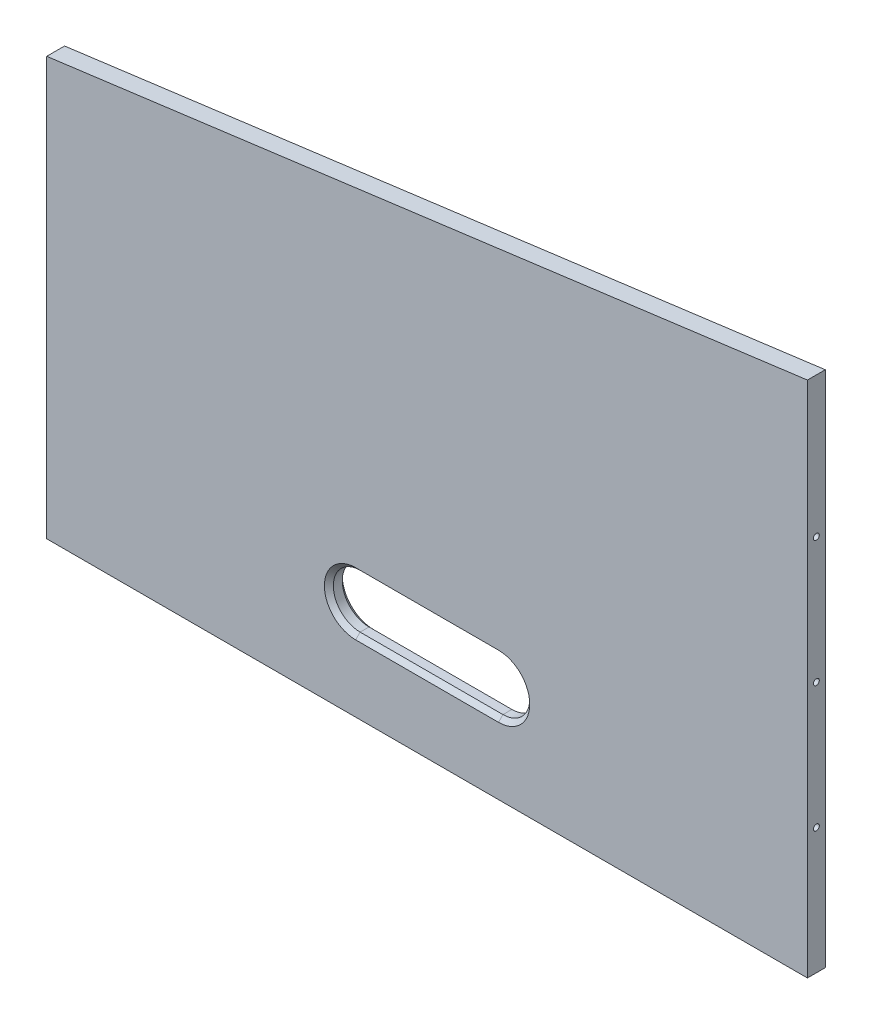
ISO-10303-21;
HEADER;
FILE_DESCRIPTION(('STEP AP214'),'2;1');
FILE_NAME('part.step','',(''),(''),'','','');
FILE_SCHEMA(('AUTOMOTIVE_DESIGN { 1 0 10303 214 1 1 1 1 }'));
ENDSEC;
DATA;
#1=APPLICATION_CONTEXT('core data for automotive mechanical design processes');
#2=APPLICATION_PROTOCOL_DEFINITION('international standard','automotive_design',2000,#1);
#3=PRODUCT_CONTEXT('',#1,'mechanical');
#4=PRODUCT('Part','Part','',(#3));
#5=PRODUCT_RELATED_PRODUCT_CATEGORY('part','',(#4));
#6=PRODUCT_DEFINITION_FORMATION('','',#4);
#7=PRODUCT_DEFINITION_CONTEXT('part definition',#1,'design');
#8=PRODUCT_DEFINITION('design','',#6,#7);
#9=PRODUCT_DEFINITION_SHAPE('','',#8);
#10=(LENGTH_UNIT() NAMED_UNIT(*) SI_UNIT(.MILLI.,.METRE.));
#11=(NAMED_UNIT(*) PLANE_ANGLE_UNIT() SI_UNIT($,.RADIAN.));
#12=(NAMED_UNIT(*) SI_UNIT($,.STERADIAN.) SOLID_ANGLE_UNIT());
#13=UNCERTAINTY_MEASURE_WITH_UNIT(LENGTH_MEASURE(1.E-05),#10,'distance_accuracy_value','');
#14=(GEOMETRIC_REPRESENTATION_CONTEXT(3) GLOBAL_UNCERTAINTY_ASSIGNED_CONTEXT((#13)) GLOBAL_UNIT_ASSIGNED_CONTEXT((#10,
#11,#12)) REPRESENTATION_CONTEXT('',''));
#15=CARTESIAN_POINT('',(0.,0.,0.));
#16=DIRECTION('',(0.,0.,1.));
#17=DIRECTION('',(1.,0.,0.));
#18=AXIS2_PLACEMENT_3D('',#15,#16,#17);
#19=CARTESIAN_POINT('',(0.,234.,10.));
#20=DIRECTION('',(-1.,0.,0.));
#21=DIRECTION('',(0.,0.,1.));
#22=AXIS2_PLACEMENT_3D('',#19,#20,#21);
#23=PLANE('',#22);
#24=CARTESIAN_POINT('',(0.,70.5,5.));
#25=DIRECTION('',(1.,0.,0.));
#26=DIRECTION('',(0.,0.,-1.));
#27=AXIS2_PLACEMENT_3D('',#24,#25,#26);
#28=CIRCLE('',#27,1.64999999999998);
#29=CARTESIAN_POINT('',(0.,70.5,3.35000000000002));
#30=VERTEX_POINT('',#29);
#31=EDGE_CURVE('E177',#30,#30,#28,.T.);
#32=ORIENTED_EDGE('',*,*,#31,.F.);
#33=EDGE_LOOP('',(#32));
#34=FACE_BOUND('',#33,.T.);
#35=CARTESIAN_POINT('',(0.,141.,5.));
#36=DIRECTION('',(1.,0.,0.));
#37=DIRECTION('',(0.,0.,-1.));
#38=AXIS2_PLACEMENT_3D('',#35,#36,#37);
#39=CIRCLE('',#38,1.64999999999998);
#40=CARTESIAN_POINT('',(0.,141.,3.35000000000002));
#41=VERTEX_POINT('',#40);
#42=EDGE_CURVE('E176',#41,#41,#39,.T.);
#43=ORIENTED_EDGE('',*,*,#42,.F.);
#44=EDGE_LOOP('',(#43));
#45=FACE_BOUND('',#44,.T.);
#46=CARTESIAN_POINT('',(0.,211.5,5.));
#47=DIRECTION('',(1.,0.,0.));
#48=DIRECTION('',(0.,0.,-1.));
#49=AXIS2_PLACEMENT_3D('',#46,#47,#48);
#50=CIRCLE('',#49,1.64999999999998);
#51=CARTESIAN_POINT('',(0.,211.5,3.35000000000002));
#52=VERTEX_POINT('',#51);
#53=EDGE_CURVE('E187',#52,#52,#50,.T.);
#54=ORIENTED_EDGE('',*,*,#53,.F.);
#55=EDGE_LOOP('',(#54));
#56=FACE_BOUND('',#55,.T.);
#57=DIRECTION('',(0.,1.,0.));
#58=VECTOR('',#57,1.);
#59=CARTESIAN_POINT('',(0.,234.,0.));
#60=LINE('',#59,#58);
#61=CARTESIAN_POINT('',(0.,0.,0.));
#62=VERTEX_POINT('',#61);
#63=CARTESIAN_POINT('',(0.,290.,0.));
#64=VERTEX_POINT('',#63);
#65=EDGE_CURVE('E233',#62,#64,#60,.T.);
#66=ORIENTED_EDGE('',*,*,#65,.T.);
#67=DIRECTION('',(0.,0.,-1.));
#68=VECTOR('',#67,1.);
#69=CARTESIAN_POINT('',(0.,290.,10.));
#70=LINE('',#69,#68);
#71=CARTESIAN_POINT('',(0.,290.,10.));
#72=VERTEX_POINT('',#71);
#73=EDGE_CURVE('E269',#72,#64,#70,.T.);
#74=ORIENTED_EDGE('',*,*,#73,.F.);
#75=DIRECTION('',(0.,1.,0.));
#76=VECTOR('',#75,1.);
#77=CARTESIAN_POINT('',(0.,0.,10.));
#78=LINE('',#77,#76);
#79=CARTESIAN_POINT('',(0.,0.,10.));
#80=VERTEX_POINT('',#79);
#81=EDGE_CURVE('E244',#80,#72,#78,.T.);
#82=ORIENTED_EDGE('',*,*,#81,.F.);
#83=DIRECTION('',(0.,0.,-1.));
#84=VECTOR('',#83,1.);
#85=CARTESIAN_POINT('',(0.,0.,10.));
#86=LINE('',#85,#84);
#87=EDGE_CURVE('E253',#80,#62,#86,.T.);
#88=ORIENTED_EDGE('',*,*,#87,.T.);
#89=EDGE_LOOP('',(#66,#74,#82,#88));
#90=FACE_BOUND('',#89,.T.);
#91=ADVANCED_FACE('F50',(#34,#45,#56,#90),#23,.F.);
#92=CARTESIAN_POINT('',(0.,290.,10.));
#93=DIRECTION('',(0.130334101809919,-0.991470131625457,0.));
#94=DIRECTION('',(0.991470131625457,0.130334101809919,0.));
#95=AXIS2_PLACEMENT_3D('',#92,#93,#94);
#96=PLANE('',#95);
#97=DIRECTION('',(-0.991470131625457,-0.130334101809919,0.));
#98=VECTOR('',#97,1.);
#99=CARTESIAN_POINT('',(0.,290.,0.));
#100=LINE('',#99,#98);
#101=CARTESIAN_POINT('',(-426.,234.,0.));
#102=VERTEX_POINT('',#101);
#103=EDGE_CURVE('E255',#64,#102,#100,.T.);
#104=ORIENTED_EDGE('',*,*,#103,.T.);
#105=DIRECTION('',(0.,0.,-1.));
#106=VECTOR('',#105,1.);
#107=CARTESIAN_POINT('',(-426.,234.,10.));
#108=LINE('',#107,#106);
#109=CARTESIAN_POINT('',(-426.,234.,10.));
#110=VERTEX_POINT('',#109);
#111=EDGE_CURVE('E266',#110,#102,#108,.T.);
#112=ORIENTED_EDGE('',*,*,#111,.F.);
#113=DIRECTION('',(-0.991470131625457,-0.130334101809919,0.));
#114=VECTOR('',#113,1.);
#115=CARTESIAN_POINT('',(0.,290.,10.));
#116=LINE('',#115,#114);
#117=EDGE_CURVE('E246',#72,#110,#116,.T.);
#118=ORIENTED_EDGE('',*,*,#117,.F.);
#119=ORIENTED_EDGE('',*,*,#73,.T.);
#120=EDGE_LOOP('',(#104,#112,#118,#119));
#121=FACE_BOUND('',#120,.T.);
#122=ADVANCED_FACE('F379',(#121),#96,.F.);
#123=CARTESIAN_POINT('',(-426.,0.,10.));
#124=DIRECTION('',(1.,0.,0.));
#125=DIRECTION('',(0.,0.,-1.));
#126=AXIS2_PLACEMENT_3D('',#123,#124,#125);
#127=PLANE('',#126);
#128=CARTESIAN_POINT('',(-426.,70.4999999999999,5.));
#129=DIRECTION('',(-1.,0.,0.));
#130=DIRECTION('',(0.,0.,1.));
#131=AXIS2_PLACEMENT_3D('',#128,#129,#130);
#132=CIRCLE('',#131,1.64999999999998);
#133=CARTESIAN_POINT('',(-426.,70.4999999999999,6.64999999999999));
#134=VERTEX_POINT('',#133);
#135=EDGE_CURVE('E193',#134,#134,#132,.T.);
#136=ORIENTED_EDGE('',*,*,#135,.F.);
#137=EDGE_LOOP('',(#136));
#138=FACE_BOUND('',#137,.T.);
#139=CARTESIAN_POINT('',(-426.,141.,5.));
#140=DIRECTION('',(-1.,0.,0.));
#141=DIRECTION('',(0.,0.,1.));
#142=AXIS2_PLACEMENT_3D('',#139,#140,#141);
#143=CIRCLE('',#142,1.64999999999998);
#144=CARTESIAN_POINT('',(-426.,141.,6.64999999999999));
#145=VERTEX_POINT('',#144);
#146=EDGE_CURVE('E199',#145,#145,#143,.T.);
#147=ORIENTED_EDGE('',*,*,#146,.F.);
#148=EDGE_LOOP('',(#147));
#149=FACE_BOUND('',#148,.T.);
#150=CARTESIAN_POINT('',(-426.,211.5,5.));
#151=DIRECTION('',(-1.,0.,0.));
#152=DIRECTION('',(0.,0.,1.));
#153=AXIS2_PLACEMENT_3D('',#150,#151,#152);
#154=CIRCLE('',#153,1.64999999999998);
#155=CARTESIAN_POINT('',(-426.,211.5,6.64999999999999));
#156=VERTEX_POINT('',#155);
#157=EDGE_CURVE('E205',#156,#156,#154,.T.);
#158=ORIENTED_EDGE('',*,*,#157,.F.);
#159=EDGE_LOOP('',(#158));
#160=FACE_BOUND('',#159,.T.);
#161=DIRECTION('',(0.,-1.,0.));
#162=VECTOR('',#161,1.);
#163=CARTESIAN_POINT('',(-426.,0.,0.));
#164=LINE('',#163,#162);
#165=CARTESIAN_POINT('',(-426.,0.,0.));
#166=VERTEX_POINT('',#165);
#167=EDGE_CURVE('E257',#102,#166,#164,.T.);
#168=ORIENTED_EDGE('',*,*,#167,.T.);
#169=DIRECTION('',(0.,0.,-1.));
#170=VECTOR('',#169,1.);
#171=CARTESIAN_POINT('',(-426.,0.,10.));
#172=LINE('',#171,#170);
#173=CARTESIAN_POINT('',(-426.,0.,10.));
#174=VERTEX_POINT('',#173);
#175=EDGE_CURVE('E263',#174,#166,#172,.T.);
#176=ORIENTED_EDGE('',*,*,#175,.F.);
#177=DIRECTION('',(0.,-1.,0.));
#178=VECTOR('',#177,1.);
#179=CARTESIAN_POINT('',(-426.,0.,10.));
#180=LINE('',#179,#178);
#181=EDGE_CURVE('E249',#110,#174,#180,.T.);
#182=ORIENTED_EDGE('',*,*,#181,.F.);
#183=ORIENTED_EDGE('',*,*,#111,.T.);
#184=EDGE_LOOP('',(#168,#176,#182,#183));
#185=FACE_BOUND('',#184,.T.);
#186=ADVANCED_FACE('F384',(#138,#149,#160,#185),#127,.F.);
#187=CARTESIAN_POINT('',(0.,0.,10.));
#188=DIRECTION('',(0.,1.,0.));
#189=DIRECTION('',(-1.,0.,0.));
#190=AXIS2_PLACEMENT_3D('',#187,#188,#189);
#191=PLANE('',#190);
#192=CARTESIAN_POINT('',(-63.,0.,5.));
#193=DIRECTION('',(0.,-1.,0.));
#194=DIRECTION('',(0.,0.,-1.));
#195=AXIS2_PLACEMENT_3D('',#192,#193,#194);
#196=CIRCLE('',#195,1.65);
#197=CARTESIAN_POINT('',(-63.,0.,3.35));
#198=VERTEX_POINT('',#197);
#199=EDGE_CURVE('E211',#198,#198,#196,.T.);
#200=ORIENTED_EDGE('',*,*,#199,.F.);
#201=EDGE_LOOP('',(#200));
#202=FACE_BOUND('',#201,.T.);
#203=CARTESIAN_POINT('',(-213.,0.,5.00000000000002));
#204=DIRECTION('',(0.,-1.,0.));
#205=DIRECTION('',(0.,0.,-1.));
#206=AXIS2_PLACEMENT_3D('',#203,#204,#205);
#207=CIRCLE('',#206,1.65000000000001);
#208=CARTESIAN_POINT('',(-213.,0.,3.35000000000001));
#209=VERTEX_POINT('',#208);
#210=EDGE_CURVE('E217',#209,#209,#207,.T.);
#211=ORIENTED_EDGE('',*,*,#210,.F.);
#212=EDGE_LOOP('',(#211));
#213=FACE_BOUND('',#212,.T.);
#214=CARTESIAN_POINT('',(-363.,0.,5.00000000000003));
#215=DIRECTION('',(0.,-1.,0.));
#216=DIRECTION('',(0.,0.,-1.));
#217=AXIS2_PLACEMENT_3D('',#214,#215,#216);
#218=CIRCLE('',#217,1.64999999999998);
#219=CARTESIAN_POINT('',(-363.,0.,3.35000000000005));
#220=VERTEX_POINT('',#219);
#221=EDGE_CURVE('E223',#220,#220,#218,.T.);
#222=ORIENTED_EDGE('',*,*,#221,.F.);
#223=EDGE_LOOP('',(#222));
#224=FACE_BOUND('',#223,.T.);
#225=DIRECTION('',(1.,0.,0.));
#226=VECTOR('',#225,1.);
#227=CARTESIAN_POINT('',(0.,0.,0.));
#228=LINE('',#227,#226);
#229=EDGE_CURVE('E247',#166,#62,#228,.T.);
#230=ORIENTED_EDGE('',*,*,#229,.T.);
#231=ORIENTED_EDGE('',*,*,#87,.F.);
#232=DIRECTION('',(1.,0.,0.));
#233=VECTOR('',#232,1.);
#234=CARTESIAN_POINT('',(0.,0.,10.));
#235=LINE('',#234,#233);
#236=EDGE_CURVE('E251',#174,#80,#235,.T.);
#237=ORIENTED_EDGE('',*,*,#236,.F.);
#238=ORIENTED_EDGE('',*,*,#175,.T.);
#239=EDGE_LOOP('',(#230,#231,#237,#238));
#240=FACE_BOUND('',#239,.T.);
#241=ADVANCED_FACE('F368',(#202,#213,#224,#240),#191,.F.);
#242=CARTESIAN_POINT('',(0.,0.,10.));
#243=DIRECTION('',(0.,0.,1.));
#244=DIRECTION('',(1.,0.,0.));
#245=AXIS2_PLACEMENT_3D('',#242,#243,#244);
#246=PLANE('',#245);
#247=DIRECTION('',(-1.,0.,0.));
#248=VECTOR('',#247,1.);
#249=CARTESIAN_POINT('',(-253.,37.5,10.));
#250=LINE('',#249,#248);
#251=CARTESIAN_POINT('',(-173.,37.5,10.));
#252=VERTEX_POINT('',#251);
#253=CARTESIAN_POINT('',(-253.,37.5,10.));
#254=VERTEX_POINT('',#253);
#255=EDGE_CURVE('E276',#252,#254,#250,.T.);
#256=ORIENTED_EDGE('',*,*,#255,.T.);
#257=CARTESIAN_POINT('',(-253.,55.,10.));
#258=DIRECTION('',(0.,0.,1.));
#259=DIRECTION('',(1.,0.,0.));
#260=AXIS2_PLACEMENT_3D('',#257,#258,#259);
#261=CIRCLE('',#260,17.5);
#262=CARTESIAN_POINT('',(-253.,72.5,10.));
#263=VERTEX_POINT('',#262);
#264=EDGE_CURVE('E278',#254,#263,#261,.F.);
#265=ORIENTED_EDGE('',*,*,#264,.T.);
#266=DIRECTION('',(1.,0.,0.));
#267=VECTOR('',#266,1.);
#268=CARTESIAN_POINT('',(-173.,72.5,10.));
#269=LINE('',#268,#267);
#270=CARTESIAN_POINT('',(-173.,72.5,10.));
#271=VERTEX_POINT('',#270);
#272=EDGE_CURVE('E272',#263,#271,#269,.T.);
#273=ORIENTED_EDGE('',*,*,#272,.T.);
#274=CARTESIAN_POINT('',(-173.,55.,10.));
#275=DIRECTION('',(0.,0.,1.));
#276=DIRECTION('',(1.,0.,0.));
#277=AXIS2_PLACEMENT_3D('',#274,#275,#276);
#278=CIRCLE('',#277,17.5);
#279=EDGE_CURVE('E274',#271,#252,#278,.F.);
#280=ORIENTED_EDGE('',*,*,#279,.T.);
#281=EDGE_LOOP('',(#256,#265,#273,#280));
#282=FACE_BOUND('',#281,.T.);
#283=ORIENTED_EDGE('',*,*,#81,.T.);
#284=ORIENTED_EDGE('',*,*,#117,.T.);
#285=ORIENTED_EDGE('',*,*,#181,.T.);
#286=ORIENTED_EDGE('',*,*,#236,.T.);
#287=EDGE_LOOP('',(#283,#284,#285,#286));
#288=FACE_BOUND('',#287,.T.);
#289=ADVANCED_FACE('F365',(#282,#288),#246,.T.);
#290=CARTESIAN_POINT('',(0.,0.,0.));
#291=DIRECTION('',(0.,0.,1.));
#292=DIRECTION('',(1.,0.,0.));
#293=AXIS2_PLACEMENT_3D('',#290,#291,#292);
#294=PLANE('',#293);
#295=DIRECTION('',(-1.,0.,0.));
#296=VECTOR('',#295,1.);
#297=CARTESIAN_POINT('',(0.,72.5000000000001,0.));
#298=LINE('',#297,#296);
#299=CARTESIAN_POINT('',(-173.,72.5000000000001,0.));
#300=VERTEX_POINT('',#299);
#301=CARTESIAN_POINT('',(-253.,72.5000000000001,0.));
#302=VERTEX_POINT('',#301);
#303=EDGE_CURVE('E299',#300,#302,#298,.T.);
#304=ORIENTED_EDGE('',*,*,#303,.T.);
#305=CARTESIAN_POINT('',(-253.,55.,0.));
#306=DIRECTION('',(0.,0.,1.));
#307=DIRECTION('',(1.,0.,0.));
#308=AXIS2_PLACEMENT_3D('',#305,#306,#307);
#309=CIRCLE('',#308,17.5000000000001);
#310=CARTESIAN_POINT('',(-253.,37.4999999999999,0.));
#311=VERTEX_POINT('',#310);
#312=EDGE_CURVE('E13',#302,#311,#309,.T.);
#313=ORIENTED_EDGE('',*,*,#312,.T.);
#314=DIRECTION('',(1.,0.,0.));
#315=VECTOR('',#314,1.);
#316=CARTESIAN_POINT('',(0.,37.4999999999999,0.));
#317=LINE('',#316,#315);
#318=CARTESIAN_POINT('',(-173.,37.4999999999999,0.));
#319=VERTEX_POINT('',#318);
#320=EDGE_CURVE('E59',#311,#319,#317,.T.);
#321=ORIENTED_EDGE('',*,*,#320,.T.);
#322=CARTESIAN_POINT('',(-173.,55.,0.));
#323=DIRECTION('',(0.,0.,1.));
#324=DIRECTION('',(1.,0.,0.));
#325=AXIS2_PLACEMENT_3D('',#322,#323,#324);
#326=CIRCLE('',#325,17.5000000000001);
#327=EDGE_CURVE('E301',#319,#300,#326,.T.);
#328=ORIENTED_EDGE('',*,*,#327,.T.);
#329=EDGE_LOOP('',(#304,#313,#321,#328));
#330=FACE_BOUND('',#329,.T.);
#331=ORIENTED_EDGE('',*,*,#65,.F.);
#332=ORIENTED_EDGE('',*,*,#229,.F.);
#333=ORIENTED_EDGE('',*,*,#167,.F.);
#334=ORIENTED_EDGE('',*,*,#103,.F.);
#335=EDGE_LOOP('',(#331,#332,#333,#334));
#336=FACE_BOUND('',#335,.T.);
#337=ADVANCED_FACE('F327',(#330,#336),#294,.F.);
#338=CARTESIAN_POINT('',(-253.,55.,10.));
#339=DIRECTION('',(0.,0.,-1.));
#340=DIRECTION('',(-1.,0.,0.));
#341=AXIS2_PLACEMENT_3D('',#338,#339,#340);
#342=CYLINDRICAL_SURFACE('',#341,15.);
#343=DIRECTION('',(0.,0.,-1.));
#344=VECTOR('',#343,1.);
#345=CARTESIAN_POINT('',(-253.,70.,10.));
#346=LINE('',#345,#344);
#347=CARTESIAN_POINT('',(-253.,70.,7.49999999999994));
#348=VERTEX_POINT('',#347);
#349=CARTESIAN_POINT('',(-253.,70.,2.50000000000011));
#350=VERTEX_POINT('',#349);
#351=EDGE_CURVE('E240',#348,#350,#346,.T.);
#352=ORIENTED_EDGE('',*,*,#351,.F.);
#353=CARTESIAN_POINT('',(-253.,55.,7.49999999999994));
#354=DIRECTION('',(0.,0.,1.));
#355=DIRECTION('',(1.,0.,0.));
#356=AXIS2_PLACEMENT_3D('',#353,#354,#355);
#357=CIRCLE('',#356,15.);
#358=CARTESIAN_POINT('',(-253.,40.,7.49999999999994));
#359=VERTEX_POINT('',#358);
#360=EDGE_CURVE('E284',#348,#359,#357,.T.);
#361=ORIENTED_EDGE('',*,*,#360,.T.);
#362=DIRECTION('',(0.,0.,-1.));
#363=VECTOR('',#362,1.);
#364=CARTESIAN_POINT('',(-253.,40.,10.));
#365=LINE('',#364,#363);
#366=CARTESIAN_POINT('',(-253.,40.,2.50000000000011));
#367=VERTEX_POINT('',#366);
#368=EDGE_CURVE('E230',#359,#367,#365,.T.);
#369=ORIENTED_EDGE('',*,*,#368,.T.);
#370=CARTESIAN_POINT('',(-253.,55.,2.50000000000011));
#371=DIRECTION('',(0.,0.,1.));
#372=DIRECTION('',(1.,0.,0.));
#373=AXIS2_PLACEMENT_3D('',#370,#371,#372);
#374=CIRCLE('',#373,15.);
#375=EDGE_CURVE('E281',#367,#350,#374,.F.);
#376=ORIENTED_EDGE('',*,*,#375,.T.);
#377=EDGE_LOOP('',(#352,#361,#369,#376));
#378=FACE_BOUND('',#377,.T.);
#379=ADVANCED_FACE('F336',(#378),#342,.F.);
#380=CARTESIAN_POINT('',(-173.,40.,10.));
#381=DIRECTION('',(0.,-1.,0.));
#382=DIRECTION('',(0.,0.,-1.));
#383=AXIS2_PLACEMENT_3D('',#380,#381,#382);
#384=PLANE('',#383);
#385=ORIENTED_EDGE('',*,*,#368,.F.);
#386=DIRECTION('',(1.,0.,0.));
#387=VECTOR('',#386,1.);
#388=CARTESIAN_POINT('',(-173.,40.,7.49999999999994));
#389=LINE('',#388,#387);
#390=CARTESIAN_POINT('',(-173.,40.,7.49999999999994));
#391=VERTEX_POINT('',#390);
#392=EDGE_CURVE('E289',#359,#391,#389,.T.);
#393=ORIENTED_EDGE('',*,*,#392,.T.);
#394=DIRECTION('',(0.,0.,-1.));
#395=VECTOR('',#394,1.);
#396=CARTESIAN_POINT('',(-173.,40.,10.));
#397=LINE('',#396,#395);
#398=CARTESIAN_POINT('',(-173.,40.,2.50000000000011));
#399=VERTEX_POINT('',#398);
#400=EDGE_CURVE('E234',#391,#399,#397,.T.);
#401=ORIENTED_EDGE('',*,*,#400,.T.);
#402=DIRECTION('',(-1.,0.,0.));
#403=VECTOR('',#402,1.);
#404=CARTESIAN_POINT('',(-173.,40.,2.50000000000011));
#405=LINE('',#404,#403);
#406=EDGE_CURVE('E287',#399,#367,#405,.T.);
#407=ORIENTED_EDGE('',*,*,#406,.T.);
#408=EDGE_LOOP('',(#385,#393,#401,#407));
#409=FACE_BOUND('',#408,.T.);
#410=ADVANCED_FACE('F352',(#409),#384,.F.);
#411=CARTESIAN_POINT('',(-173.,55.,10.));
#412=DIRECTION('',(0.,0.,-1.));
#413=DIRECTION('',(-1.,0.,0.));
#414=AXIS2_PLACEMENT_3D('',#411,#412,#413);
#415=CYLINDRICAL_SURFACE('',#414,15.);
#416=ORIENTED_EDGE('',*,*,#400,.F.);
#417=CARTESIAN_POINT('',(-173.,55.,7.49999999999994));
#418=DIRECTION('',(0.,0.,1.));
#419=DIRECTION('',(1.,0.,0.));
#420=AXIS2_PLACEMENT_3D('',#417,#418,#419);
#421=CIRCLE('',#420,15.);
#422=CARTESIAN_POINT('',(-173.,70.,7.49999999999994));
#423=VERTEX_POINT('',#422);
#424=EDGE_CURVE('E293',#391,#423,#421,.T.);
#425=ORIENTED_EDGE('',*,*,#424,.T.);
#426=DIRECTION('',(0.,0.,-1.));
#427=VECTOR('',#426,1.);
#428=CARTESIAN_POINT('',(-173.,70.,10.));
#429=LINE('',#428,#427);
#430=CARTESIAN_POINT('',(-173.,70.,2.50000000000011));
#431=VERTEX_POINT('',#430);
#432=EDGE_CURVE('E237',#423,#431,#429,.T.);
#433=ORIENTED_EDGE('',*,*,#432,.T.);
#434=CARTESIAN_POINT('',(-173.,55.,2.50000000000011));
#435=DIRECTION('',(0.,0.,1.));
#436=DIRECTION('',(1.,0.,0.));
#437=AXIS2_PLACEMENT_3D('',#434,#435,#436);
#438=CIRCLE('',#437,15.);
#439=EDGE_CURVE('E291',#431,#399,#438,.F.);
#440=ORIENTED_EDGE('',*,*,#439,.T.);
#441=EDGE_LOOP('',(#416,#425,#433,#440));
#442=FACE_BOUND('',#441,.T.);
#443=ADVANCED_FACE('F356',(#442),#415,.F.);
#444=CARTESIAN_POINT('',(-173.,70.,10.));
#445=DIRECTION('',(0.,1.,0.));
#446=DIRECTION('',(0.,0.,1.));
#447=AXIS2_PLACEMENT_3D('',#444,#445,#446);
#448=PLANE('',#447);
#449=ORIENTED_EDGE('',*,*,#432,.F.);
#450=DIRECTION('',(-1.,0.,0.));
#451=VECTOR('',#450,1.);
#452=CARTESIAN_POINT('',(-253.,70.,7.49999999999994));
#453=LINE('',#452,#451);
#454=EDGE_CURVE('E297',#423,#348,#453,.T.);
#455=ORIENTED_EDGE('',*,*,#454,.T.);
#456=ORIENTED_EDGE('',*,*,#351,.T.);
#457=DIRECTION('',(1.,0.,0.));
#458=VECTOR('',#457,1.);
#459=CARTESIAN_POINT('',(-173.,70.,2.50000000000011));
#460=LINE('',#459,#458);
#461=EDGE_CURVE('E295',#350,#431,#460,.T.);
#462=ORIENTED_EDGE('',*,*,#461,.T.);
#463=EDGE_LOOP('',(#449,#455,#456,#462));
#464=FACE_BOUND('',#463,.T.);
#465=ADVANCED_FACE('F339',(#464),#448,.F.);
#466=CARTESIAN_POINT('',(-173.,55.,10.));
#467=DIRECTION('',(0.,0.,1.));
#468=DIRECTION('',(1.,0.,0.));
#469=AXIS2_PLACEMENT_3D('',#466,#467,#468);
#470=CONICAL_SURFACE('',#469,17.5,0.785398163397438);
#471=DIRECTION('',(0.,0.707106781186539,0.707106781186555));
#472=VECTOR('',#471,1.);
#473=CARTESIAN_POINT('',(-173.,70.,7.49999999999994));
#474=LINE('',#473,#472);
#475=EDGE_CURVE('E308',#423,#271,#474,.T.);
#476=ORIENTED_EDGE('',*,*,#475,.F.);
#477=ORIENTED_EDGE('',*,*,#424,.F.);
#478=DIRECTION('',(0.,0.70710678118654,-0.707106781186554));
#479=VECTOR('',#478,1.);
#480=CARTESIAN_POINT('',(-173.,37.5,10.));
#481=LINE('',#480,#479);
#482=EDGE_CURVE('E243',#252,#391,#481,.T.);
#483=ORIENTED_EDGE('',*,*,#482,.F.);
#484=ORIENTED_EDGE('',*,*,#279,.F.);
#485=EDGE_LOOP('',(#476,#477,#483,#484));
#486=FACE_BOUND('',#485,.T.);
#487=ADVANCED_FACE('F359',(#486),#470,.F.);
#488=CARTESIAN_POINT('',(0.,37.5,10.));
#489=DIRECTION('',(0.,0.707106781186555,0.70710678118654));
#490=DIRECTION('',(1.,0.,0.));
#491=AXIS2_PLACEMENT_3D('',#488,#489,#490);
#492=PLANE('',#491);
#493=ORIENTED_EDGE('',*,*,#482,.T.);
#494=ORIENTED_EDGE('',*,*,#392,.F.);
#495=DIRECTION('',(0.,0.70710678118654,-0.707106781186555));
#496=VECTOR('',#495,1.);
#497=CARTESIAN_POINT('',(-253.,37.5,10.));
#498=LINE('',#497,#496);
#499=EDGE_CURVE('E306',#254,#359,#498,.T.);
#500=ORIENTED_EDGE('',*,*,#499,.F.);
#501=ORIENTED_EDGE('',*,*,#255,.F.);
#502=EDGE_LOOP('',(#493,#494,#500,#501));
#503=FACE_BOUND('',#502,.T.);
#504=ADVANCED_FACE('F363',(#503),#492,.T.);
#505=CARTESIAN_POINT('',(0.,72.5,10.));
#506=DIRECTION('',(0.,-0.707106781186555,0.70710678118654));
#507=DIRECTION('',(-1.,0.,0.));
#508=AXIS2_PLACEMENT_3D('',#505,#506,#507);
#509=PLANE('',#508);
#510=ORIENTED_EDGE('',*,*,#475,.T.);
#511=ORIENTED_EDGE('',*,*,#272,.F.);
#512=DIRECTION('',(0.,0.70710678118654,0.707106781186555));
#513=VECTOR('',#512,1.);
#514=CARTESIAN_POINT('',(-253.,70.,7.49999999999994));
#515=LINE('',#514,#513);
#516=EDGE_CURVE('E304',#348,#263,#515,.T.);
#517=ORIENTED_EDGE('',*,*,#516,.F.);
#518=ORIENTED_EDGE('',*,*,#454,.F.);
#519=EDGE_LOOP('',(#510,#511,#517,#518));
#520=FACE_BOUND('',#519,.T.);
#521=ADVANCED_FACE('F344',(#520),#509,.T.);
#522=CARTESIAN_POINT('',(-253.,55.,10.));
#523=DIRECTION('',(0.,0.,1.));
#524=DIRECTION('',(1.,0.,0.));
#525=AXIS2_PLACEMENT_3D('',#522,#523,#524);
#526=CONICAL_SURFACE('',#525,17.5,0.785398163397437);
#527=ORIENTED_EDGE('',*,*,#499,.T.);
#528=ORIENTED_EDGE('',*,*,#360,.F.);
#529=ORIENTED_EDGE('',*,*,#516,.T.);
#530=ORIENTED_EDGE('',*,*,#264,.F.);
#531=EDGE_LOOP('',(#527,#528,#529,#530));
#532=FACE_BOUND('',#531,.T.);
#533=ADVANCED_FACE('F348',(#532),#526,.F.);
#534=CARTESIAN_POINT('',(-173.,55.,2.50000000000011));
#535=DIRECTION('',(0.,0.,-1.));
#536=DIRECTION('',(-1.,0.,0.));
#537=AXIS2_PLACEMENT_3D('',#534,#535,#536);
#538=CONICAL_SURFACE('',#537,15.,0.785398163397448);
#539=DIRECTION('',(0.,-0.707106781186548,0.707106781186548));
#540=VECTOR('',#539,1.);
#541=CARTESIAN_POINT('',(-173.,72.5000000000001,0.));
#542=LINE('',#541,#540);
#543=EDGE_CURVE('E314',#300,#431,#542,.T.);
#544=ORIENTED_EDGE('',*,*,#543,.F.);
#545=ORIENTED_EDGE('',*,*,#327,.F.);
#546=DIRECTION('',(0.,-0.707106781186547,-0.707106781186549));
#547=VECTOR('',#546,1.);
#548=CARTESIAN_POINT('',(-173.,40.,2.50000000000011));
#549=LINE('',#548,#547);
#550=EDGE_CURVE('E54',#399,#319,#549,.T.);
#551=ORIENTED_EDGE('',*,*,#550,.F.);
#552=ORIENTED_EDGE('',*,*,#439,.F.);
#553=EDGE_LOOP('',(#544,#545,#551,#552));
#554=FACE_BOUND('',#553,.T.);
#555=ADVANCED_FACE('F52',(#554),#538,.F.);
#556=CARTESIAN_POINT('',(-173.,40.,2.50000000000011));
#557=DIRECTION('',(0.,-0.707106781186548,0.707106781186548));
#558=DIRECTION('',(-1.,0.,0.));
#559=AXIS2_PLACEMENT_3D('',#556,#557,#558);
#560=PLANE('',#559);
#561=ORIENTED_EDGE('',*,*,#550,.T.);
#562=ORIENTED_EDGE('',*,*,#320,.F.);
#563=DIRECTION('',(0.,-0.707106781186548,-0.707106781186548));
#564=VECTOR('',#563,1.);
#565=CARTESIAN_POINT('',(-253.,40.,2.50000000000011));
#566=LINE('',#565,#564);
#567=EDGE_CURVE('E67',#367,#311,#566,.T.);
#568=ORIENTED_EDGE('',*,*,#567,.F.);
#569=ORIENTED_EDGE('',*,*,#406,.F.);
#570=EDGE_LOOP('',(#561,#562,#568,#569));
#571=FACE_BOUND('',#570,.T.);
#572=ADVANCED_FACE('F324',(#571),#560,.F.);
#573=CARTESIAN_POINT('',(-173.,70.,2.50000000000011));
#574=DIRECTION('',(0.,0.707106781186548,0.707106781186548));
#575=DIRECTION('',(1.,0.,0.));
#576=AXIS2_PLACEMENT_3D('',#573,#574,#575);
#577=PLANE('',#576);
#578=ORIENTED_EDGE('',*,*,#543,.T.);
#579=ORIENTED_EDGE('',*,*,#461,.F.);
#580=DIRECTION('',(0.,-0.707106781186548,0.707106781186548));
#581=VECTOR('',#580,1.);
#582=CARTESIAN_POINT('',(-253.,72.5000000000001,0.));
#583=LINE('',#582,#581);
#584=EDGE_CURVE('E229',#302,#350,#583,.T.);
#585=ORIENTED_EDGE('',*,*,#584,.F.);
#586=ORIENTED_EDGE('',*,*,#303,.F.);
#587=EDGE_LOOP('',(#578,#579,#585,#586));
#588=FACE_BOUND('',#587,.T.);
#589=ADVANCED_FACE('F331',(#588),#577,.F.);
#590=CARTESIAN_POINT('',(-253.,55.,2.50000000000011));
#591=DIRECTION('',(0.,0.,-1.));
#592=DIRECTION('',(-1.,0.,0.));
#593=AXIS2_PLACEMENT_3D('',#590,#591,#592);
#594=CONICAL_SURFACE('',#593,15.,0.785398163397449);
#595=ORIENTED_EDGE('',*,*,#567,.T.);
#596=ORIENTED_EDGE('',*,*,#312,.F.);
#597=ORIENTED_EDGE('',*,*,#584,.T.);
#598=ORIENTED_EDGE('',*,*,#375,.F.);
#599=EDGE_LOOP('',(#595,#596,#597,#598));
#600=FACE_BOUND('',#599,.T.);
#601=ADVANCED_FACE('F330',(#600),#594,.F.);
#602=CARTESIAN_POINT('',(-363.,12.,5.00000000000003));
#603=DIRECTION('',(0.,-1.,0.));
#604=DIRECTION('',(0.,0.,-1.));
#605=AXIS2_PLACEMENT_3D('',#602,#603,#604);
#606=CONICAL_SURFACE('',#605,1.64999999999998,1.02974425867665);
#607=CARTESIAN_POINT('',(-363.,12.9914200213954,5.00000000000003));
#608=VERTEX_POINT('',#607);
#609=VERTEX_LOOP('',#608);
#610=FACE_BOUND('',#609,.T.);
#611=CARTESIAN_POINT('',(-363.,12.,5.00000000000003));
#612=DIRECTION('',(0.,-1.,0.));
#613=DIRECTION('',(0.,0.,-1.));
#614=AXIS2_PLACEMENT_3D('',#611,#612,#613);
#615=CIRCLE('',#614,1.64999999999998);
#616=CARTESIAN_POINT('',(-363.,12.,3.35000000000005));
#617=VERTEX_POINT('',#616);
#618=EDGE_CURVE('E226',#617,#617,#615,.T.);
#619=ORIENTED_EDGE('',*,*,#618,.T.);
#620=EDGE_LOOP('',(#619));
#621=FACE_BOUND('',#620,.T.);
#622=ADVANCED_FACE('F415',(#610,#621),#606,.F.);
#623=CARTESIAN_POINT('',(-363.,0.,5.00000000000003));
#624=DIRECTION('',(0.,-1.,0.));
#625=DIRECTION('',(0.,0.,-1.));
#626=AXIS2_PLACEMENT_3D('',#623,#624,#625);
#627=CYLINDRICAL_SURFACE('',#626,1.64999999999998);
#628=ORIENTED_EDGE('',*,*,#618,.F.);
#629=EDGE_LOOP('',(#628));
#630=FACE_BOUND('',#629,.T.);
#631=ORIENTED_EDGE('',*,*,#221,.T.);
#632=EDGE_LOOP('',(#631));
#633=FACE_BOUND('',#632,.T.);
#634=ADVANCED_FACE('F507',(#630,#633),#627,.F.);
#635=CARTESIAN_POINT('',(-213.,12.,5.00000000000002));
#636=DIRECTION('',(0.,-1.,0.));
#637=DIRECTION('',(0.,0.,-1.));
#638=AXIS2_PLACEMENT_3D('',#635,#636,#637);
#639=CONICAL_SURFACE('',#638,1.64999999999998,1.02974425867665);
#640=CARTESIAN_POINT('',(-213.,12.9914200213955,5.00000000000002));
#641=VERTEX_POINT('',#640);
#642=VERTEX_LOOP('',#641);
#643=FACE_BOUND('',#642,.T.);
#644=CARTESIAN_POINT('',(-213.,12.,5.00000000000002));
#645=DIRECTION('',(0.,-1.,0.));
#646=DIRECTION('',(0.,0.,-1.));
#647=AXIS2_PLACEMENT_3D('',#644,#645,#646);
#648=CIRCLE('',#647,1.64999999999998);
#649=CARTESIAN_POINT('',(-213.,12.,3.35000000000003));
#650=VERTEX_POINT('',#649);
#651=EDGE_CURVE('E220',#650,#650,#648,.T.);
#652=ORIENTED_EDGE('',*,*,#651,.T.);
#653=EDGE_LOOP('',(#652));
#654=FACE_BOUND('',#653,.T.);
#655=ADVANCED_FACE('F518',(#643,#654),#639,.F.);
#656=CARTESIAN_POINT('',(-213.,0.,5.00000000000002));
#657=DIRECTION('',(0.,-1.,0.));
#658=DIRECTION('',(0.,0.,-1.));
#659=AXIS2_PLACEMENT_3D('',#656,#657,#658);
#660=CYLINDRICAL_SURFACE('',#659,1.65);
#661=ORIENTED_EDGE('',*,*,#651,.F.);
#662=EDGE_LOOP('',(#661));
#663=FACE_BOUND('',#662,.T.);
#664=ORIENTED_EDGE('',*,*,#210,.T.);
#665=EDGE_LOOP('',(#664));
#666=FACE_BOUND('',#665,.T.);
#667=ADVANCED_FACE('F530',(#663,#666),#660,.F.);
#668=CARTESIAN_POINT('',(-63.,12.,5.));
#669=DIRECTION('',(0.,-1.,0.));
#670=DIRECTION('',(0.,0.,-1.));
#671=AXIS2_PLACEMENT_3D('',#668,#669,#670);
#672=CONICAL_SURFACE('',#671,1.65,1.02974425867665);
#673=CARTESIAN_POINT('',(-63.,12.9914200213955,5.));
#674=VERTEX_POINT('',#673);
#675=VERTEX_LOOP('',#674);
#676=FACE_BOUND('',#675,.T.);
#677=CARTESIAN_POINT('',(-63.,12.,5.));
#678=DIRECTION('',(0.,-1.,0.));
#679=DIRECTION('',(0.,0.,-1.));
#680=AXIS2_PLACEMENT_3D('',#677,#678,#679);
#681=CIRCLE('',#680,1.65);
#682=CARTESIAN_POINT('',(-63.,12.,3.35));
#683=VERTEX_POINT('',#682);
#684=EDGE_CURVE('E214',#683,#683,#681,.T.);
#685=ORIENTED_EDGE('',*,*,#684,.T.);
#686=EDGE_LOOP('',(#685));
#687=FACE_BOUND('',#686,.T.);
#688=ADVANCED_FACE('F540',(#676,#687),#672,.F.);
#689=CARTESIAN_POINT('',(-63.,0.,5.));
#690=DIRECTION('',(0.,-1.,0.));
#691=DIRECTION('',(0.,0.,-1.));
#692=AXIS2_PLACEMENT_3D('',#689,#690,#691);
#693=CYLINDRICAL_SURFACE('',#692,1.65);
#694=ORIENTED_EDGE('',*,*,#684,.F.);
#695=EDGE_LOOP('',(#694));
#696=FACE_BOUND('',#695,.T.);
#697=ORIENTED_EDGE('',*,*,#199,.T.);
#698=EDGE_LOOP('',(#697));
#699=FACE_BOUND('',#698,.T.);
#700=ADVANCED_FACE('F551',(#696,#699),#693,.F.);
#701=CARTESIAN_POINT('',(-414.,211.5,5.));
#702=DIRECTION('',(-1.,0.,0.));
#703=DIRECTION('',(0.,0.,1.));
#704=AXIS2_PLACEMENT_3D('',#701,#702,#703);
#705=CONICAL_SURFACE('',#704,1.64999999999998,1.02974425867666);
#706=CARTESIAN_POINT('',(-413.008579978605,211.5,5.));
#707=VERTEX_POINT('',#706);
#708=VERTEX_LOOP('',#707);
#709=FACE_BOUND('',#708,.T.);
#710=CARTESIAN_POINT('',(-414.,211.5,5.));
#711=DIRECTION('',(-1.,0.,0.));
#712=DIRECTION('',(0.,0.,1.));
#713=AXIS2_PLACEMENT_3D('',#710,#711,#712);
#714=CIRCLE('',#713,1.64999999999998);
#715=CARTESIAN_POINT('',(-414.,211.5,6.64999999999999));
#716=VERTEX_POINT('',#715);
#717=EDGE_CURVE('E208',#716,#716,#714,.T.);
#718=ORIENTED_EDGE('',*,*,#717,.T.);
#719=EDGE_LOOP('',(#718));
#720=FACE_BOUND('',#719,.T.);
#721=ADVANCED_FACE('F560',(#709,#720),#705,.F.);
#722=CARTESIAN_POINT('',(-426.,211.5,5.));
#723=DIRECTION('',(-1.,0.,0.));
#724=DIRECTION('',(0.,0.,1.));
#725=AXIS2_PLACEMENT_3D('',#722,#723,#724);
#726=CYLINDRICAL_SURFACE('',#725,1.64999999999998);
#727=ORIENTED_EDGE('',*,*,#717,.F.);
#728=EDGE_LOOP('',(#727));
#729=FACE_BOUND('',#728,.T.);
#730=ORIENTED_EDGE('',*,*,#157,.T.);
#731=EDGE_LOOP('',(#730));
#732=FACE_BOUND('',#731,.T.);
#733=ADVANCED_FACE('F571',(#729,#732),#726,.F.);
#734=CARTESIAN_POINT('',(-414.,141.,5.));
#735=DIRECTION('',(-1.,0.,0.));
#736=DIRECTION('',(0.,0.,1.));
#737=AXIS2_PLACEMENT_3D('',#734,#735,#736);
#738=CONICAL_SURFACE('',#737,1.64999999999998,1.02974425867666);
#739=CARTESIAN_POINT('',(-413.008579978605,141.,5.));
#740=VERTEX_POINT('',#739);
#741=VERTEX_LOOP('',#740);
#742=FACE_BOUND('',#741,.T.);
#743=CARTESIAN_POINT('',(-414.,141.,5.));
#744=DIRECTION('',(-1.,0.,0.));
#745=DIRECTION('',(0.,0.,1.));
#746=AXIS2_PLACEMENT_3D('',#743,#744,#745);
#747=CIRCLE('',#746,1.64999999999998);
#748=CARTESIAN_POINT('',(-414.,141.,6.64999999999999));
#749=VERTEX_POINT('',#748);
#750=EDGE_CURVE('E202',#749,#749,#747,.T.);
#751=ORIENTED_EDGE('',*,*,#750,.T.);
#752=EDGE_LOOP('',(#751));
#753=FACE_BOUND('',#752,.T.);
#754=ADVANCED_FACE('F576',(#742,#753),#738,.F.);
#755=CARTESIAN_POINT('',(-426.,141.,5.));
#756=DIRECTION('',(-1.,0.,0.));
#757=DIRECTION('',(0.,0.,1.));
#758=AXIS2_PLACEMENT_3D('',#755,#756,#757);
#759=CYLINDRICAL_SURFACE('',#758,1.64999999999998);
#760=ORIENTED_EDGE('',*,*,#750,.F.);
#761=EDGE_LOOP('',(#760));
#762=FACE_BOUND('',#761,.T.);
#763=ORIENTED_EDGE('',*,*,#146,.T.);
#764=EDGE_LOOP('',(#763));
#765=FACE_BOUND('',#764,.T.);
#766=ADVANCED_FACE('F584',(#762,#765),#759,.F.);
#767=CARTESIAN_POINT('',(-414.,70.4999999999999,5.));
#768=DIRECTION('',(-1.,0.,0.));
#769=DIRECTION('',(0.,0.,1.));
#770=AXIS2_PLACEMENT_3D('',#767,#768,#769);
#771=CONICAL_SURFACE('',#770,1.65,1.02974425867666);
#772=CARTESIAN_POINT('',(-413.008579978605,70.4999999999999,5.));
#773=VERTEX_POINT('',#772);
#774=VERTEX_LOOP('',#773);
#775=FACE_BOUND('',#774,.T.);
#776=CARTESIAN_POINT('',(-414.,70.4999999999999,5.));
#777=DIRECTION('',(-1.,0.,0.));
#778=DIRECTION('',(0.,0.,1.));
#779=AXIS2_PLACEMENT_3D('',#776,#777,#778);
#780=CIRCLE('',#779,1.65);
#781=CARTESIAN_POINT('',(-414.,70.4999999999999,6.65));
#782=VERTEX_POINT('',#781);
#783=EDGE_CURVE('E196',#782,#782,#780,.T.);
#784=ORIENTED_EDGE('',*,*,#783,.T.);
#785=EDGE_LOOP('',(#784));
#786=FACE_BOUND('',#785,.T.);
#787=ADVANCED_FACE('F589',(#775,#786),#771,.F.);
#788=CARTESIAN_POINT('',(-426.,70.4999999999999,5.));
#789=DIRECTION('',(-1.,0.,0.));
#790=DIRECTION('',(0.,0.,1.));
#791=AXIS2_PLACEMENT_3D('',#788,#789,#790);
#792=CYLINDRICAL_SURFACE('',#791,1.64999999999999);
#793=ORIENTED_EDGE('',*,*,#783,.F.);
#794=EDGE_LOOP('',(#793));
#795=FACE_BOUND('',#794,.T.);
#796=ORIENTED_EDGE('',*,*,#135,.T.);
#797=EDGE_LOOP('',(#796));
#798=FACE_BOUND('',#797,.T.);
#799=ADVANCED_FACE('F597',(#795,#798),#792,.F.);
#800=CARTESIAN_POINT('',(-12.,211.5,5.));
#801=DIRECTION('',(1.,0.,0.));
#802=DIRECTION('',(0.,0.,-1.));
#803=AXIS2_PLACEMENT_3D('',#800,#801,#802);
#804=CONICAL_SURFACE('',#803,1.64999999999998,1.02974425867665);
#805=CARTESIAN_POINT('',(-12.9914200213955,211.5,5.));
#806=VERTEX_POINT('',#805);
#807=VERTEX_LOOP('',#806);
#808=FACE_BOUND('',#807,.T.);
#809=CARTESIAN_POINT('',(-12.,211.5,5.));
#810=DIRECTION('',(1.,0.,0.));
#811=DIRECTION('',(0.,0.,-1.));
#812=AXIS2_PLACEMENT_3D('',#809,#810,#811);
#813=CIRCLE('',#812,1.64999999999998);
#814=CARTESIAN_POINT('',(-12.,211.5,3.35000000000002));
#815=VERTEX_POINT('',#814);
#816=EDGE_CURVE('E190',#815,#815,#813,.T.);
#817=ORIENTED_EDGE('',*,*,#816,.T.);
#818=EDGE_LOOP('',(#817));
#819=FACE_BOUND('',#818,.T.);
#820=ADVANCED_FACE('F602',(#808,#819),#804,.F.);
#821=CARTESIAN_POINT('',(0.,211.5,5.));
#822=DIRECTION('',(1.,0.,0.));
#823=DIRECTION('',(0.,0.,-1.));
#824=AXIS2_PLACEMENT_3D('',#821,#822,#823);
#825=CYLINDRICAL_SURFACE('',#824,1.64999999999998);
#826=ORIENTED_EDGE('',*,*,#816,.F.);
#827=EDGE_LOOP('',(#826));
#828=FACE_BOUND('',#827,.T.);
#829=ORIENTED_EDGE('',*,*,#53,.T.);
#830=EDGE_LOOP('',(#829));
#831=FACE_BOUND('',#830,.T.);
#832=ADVANCED_FACE('F609',(#828,#831),#825,.F.);
#833=CARTESIAN_POINT('',(-12.,141.,5.));
#834=DIRECTION('',(1.,0.,0.));
#835=DIRECTION('',(0.,0.,-1.));
#836=AXIS2_PLACEMENT_3D('',#833,#834,#835);
#837=CONICAL_SURFACE('',#836,1.64999999999998,1.02974425867665);
#838=CARTESIAN_POINT('',(-12.9914200213955,141.,5.));
#839=VERTEX_POINT('',#838);
#840=VERTEX_LOOP('',#839);
#841=FACE_BOUND('',#840,.T.);
#842=CARTESIAN_POINT('',(-12.,141.,5.));
#843=DIRECTION('',(1.,0.,0.));
#844=DIRECTION('',(0.,0.,-1.));
#845=AXIS2_PLACEMENT_3D('',#842,#843,#844);
#846=CIRCLE('',#845,1.64999999999998);
#847=CARTESIAN_POINT('',(-12.,141.,3.35000000000002));
#848=VERTEX_POINT('',#847);
#849=EDGE_CURVE('E180',#848,#848,#846,.T.);
#850=ORIENTED_EDGE('',*,*,#849,.T.);
#851=EDGE_LOOP('',(#850));
#852=FACE_BOUND('',#851,.T.);
#853=ADVANCED_FACE('F613',(#841,#852),#837,.F.);
#854=CARTESIAN_POINT('',(0.,141.,5.));
#855=DIRECTION('',(1.,0.,0.));
#856=DIRECTION('',(0.,0.,-1.));
#857=AXIS2_PLACEMENT_3D('',#854,#855,#856);
#858=CYLINDRICAL_SURFACE('',#857,1.64999999999998);
#859=ORIENTED_EDGE('',*,*,#849,.F.);
#860=EDGE_LOOP('',(#859));
#861=FACE_BOUND('',#860,.T.);
#862=ORIENTED_EDGE('',*,*,#42,.T.);
#863=EDGE_LOOP('',(#862));
#864=FACE_BOUND('',#863,.T.);
#865=ADVANCED_FACE('F170',(#861,#864),#858,.F.);
#866=CARTESIAN_POINT('',(-12.,70.5,5.));
#867=DIRECTION('',(1.,0.,0.));
#868=DIRECTION('',(0.,0.,-1.));
#869=AXIS2_PLACEMENT_3D('',#866,#867,#868);
#870=CONICAL_SURFACE('',#869,1.64999999999998,1.02974425867665);
#871=CARTESIAN_POINT('',(-12.9914200213955,70.5,5.));
#872=VERTEX_POINT('',#871);
#873=VERTEX_LOOP('',#872);
#874=FACE_BOUND('',#873,.T.);
#875=CARTESIAN_POINT('',(-12.,70.5,5.));
#876=DIRECTION('',(1.,0.,0.));
#877=DIRECTION('',(0.,0.,-1.));
#878=AXIS2_PLACEMENT_3D('',#875,#876,#877);
#879=CIRCLE('',#878,1.64999999999998);
#880=CARTESIAN_POINT('',(-12.,70.5,3.35000000000002));
#881=VERTEX_POINT('',#880);
#882=EDGE_CURVE('E174',#881,#881,#879,.T.);
#883=ORIENTED_EDGE('',*,*,#882,.T.);
#884=EDGE_LOOP('',(#883));
#885=FACE_BOUND('',#884,.T.);
#886=ADVANCED_FACE('F166',(#874,#885),#870,.F.);
#887=CARTESIAN_POINT('',(0.,70.5,5.));
#888=DIRECTION('',(1.,0.,0.));
#889=DIRECTION('',(0.,0.,-1.));
#890=AXIS2_PLACEMENT_3D('',#887,#888,#889);
#891=CYLINDRICAL_SURFACE('',#890,1.64999999999998);
#892=ORIENTED_EDGE('',*,*,#882,.F.);
#893=EDGE_LOOP('',(#892));
#894=FACE_BOUND('',#893,.T.);
#895=ORIENTED_EDGE('',*,*,#31,.T.);
#896=EDGE_LOOP('',(#895));
#897=FACE_BOUND('',#896,.T.);
#898=ADVANCED_FACE('F169',(#894,#897),#891,.F.);
#899=CLOSED_SHELL('',(#91,#122,#186,#241,#289,#337,#379,#410,#443,#465,#487,#504,#521,#533,#555,
#572,#589,#601,#622,#634,#655,#667,#688,#700,#721,#733,#754,#766,#787,#799,#820,#832,#853,#865,
#886,#898));
#900=MANIFOLD_SOLID_BREP('B2',#899);
#901=ADVANCED_BREP_SHAPE_REPRESENTATION('',(#18,#900),#14);
#902=SHAPE_DEFINITION_REPRESENTATION(#9,#901);
ENDSEC;
END-ISO-10303-21;
